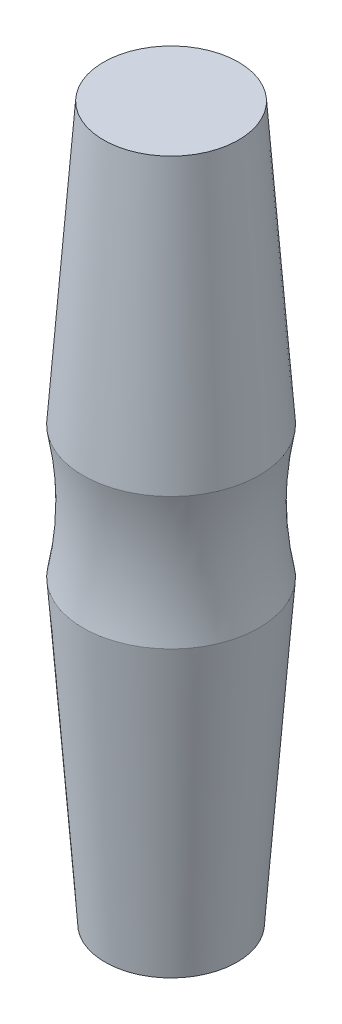
ISO-10303-21;
HEADER;
FILE_DESCRIPTION(('STEP AP214'),'2;1');
FILE_NAME('part.step','',(''),(''),'','','');
FILE_SCHEMA(('AUTOMOTIVE_DESIGN { 1 0 10303 214 1 1 1 1 }'));
ENDSEC;
DATA;
#1=APPLICATION_CONTEXT('core data for automotive mechanical design processes');
#2=APPLICATION_PROTOCOL_DEFINITION('international standard','automotive_design',2000,#1);
#3=PRODUCT_CONTEXT('',#1,'mechanical');
#4=PRODUCT('Part','Part','',(#3));
#5=PRODUCT_RELATED_PRODUCT_CATEGORY('part','',(#4));
#6=PRODUCT_DEFINITION_FORMATION('','',#4);
#7=PRODUCT_DEFINITION_CONTEXT('part definition',#1,'design');
#8=PRODUCT_DEFINITION('design','',#6,#7);
#9=PRODUCT_DEFINITION_SHAPE('','',#8);
#10=(LENGTH_UNIT() NAMED_UNIT(*) SI_UNIT(.MILLI.,.METRE.));
#11=(NAMED_UNIT(*) PLANE_ANGLE_UNIT() SI_UNIT($,.RADIAN.));
#12=(NAMED_UNIT(*) SI_UNIT($,.STERADIAN.) SOLID_ANGLE_UNIT());
#13=UNCERTAINTY_MEASURE_WITH_UNIT(LENGTH_MEASURE(1.E-05),#10,'distance_accuracy_value','');
#14=(GEOMETRIC_REPRESENTATION_CONTEXT(3) GLOBAL_UNCERTAINTY_ASSIGNED_CONTEXT((#13)) GLOBAL_UNIT_ASSIGNED_CONTEXT((#10,
#11,#12)) REPRESENTATION_CONTEXT('',''));
#15=CARTESIAN_POINT('',(0.,0.,0.));
#16=DIRECTION('',(0.,0.,1.));
#17=DIRECTION('',(1.,0.,0.));
#18=AXIS2_PLACEMENT_3D('',#15,#16,#17);
#19=CARTESIAN_POINT('',(6.,-33.31,0.));
#20=DIRECTION('',(0.,-1.,0.));
#21=DIRECTION('',(0.,0.,-1.));
#22=AXIS2_PLACEMENT_3D('',#19,#20,#21);
#23=PLANE('',#22);
#24=CARTESIAN_POINT('',(0.,-33.31,0.));
#25=DIRECTION('',(0.,-1.,0.));
#26=DIRECTION('',(0.,0.,-1.));
#27=AXIS2_PLACEMENT_3D('',#24,#25,#26);
#28=CIRCLE('',#27,6.);
#29=CARTESIAN_POINT('',(0.,-33.31,-6.));
#30=VERTEX_POINT('',#29);
#31=EDGE_CURVE('E10',#30,#30,#28,.T.);
#32=ORIENTED_EDGE('',*,*,#31,.T.);
#33=EDGE_LOOP('',(#32));
#34=FACE_BOUND('',#33,.T.);
#35=ADVANCED_FACE('F35',(#34),#23,.T.);
#36=CARTESIAN_POINT('',(0.,-33.31,0.));
#37=DIRECTION('',(0.,1.,0.));
#38=DIRECTION('',(0.,0.,1.));
#39=AXIS2_PLACEMENT_3D('',#36,#37,#38);
#40=CONICAL_SURFACE('',#39,6.,0.073102748280893);
#41=CARTESIAN_POINT('',(0.,-5.99999999999998,0.));
#42=DIRECTION('',(0.,-1.,0.));
#43=DIRECTION('',(0.,0.,-1.));
#44=AXIS2_PLACEMENT_3D('',#41,#42,#43);
#45=CIRCLE('',#44,8.);
#46=CARTESIAN_POINT('',(0.,-5.99999999999998,-8.));
#47=VERTEX_POINT('',#46);
#48=EDGE_CURVE('E41',#47,#47,#45,.T.);
#49=ORIENTED_EDGE('',*,*,#48,.T.);
#50=EDGE_LOOP('',(#49));
#51=FACE_BOUND('',#50,.T.);
#52=ORIENTED_EDGE('',*,*,#31,.F.);
#53=EDGE_LOOP('',(#52));
#54=FACE_BOUND('',#53,.T.);
#55=ADVANCED_FACE('F67',(#51,#54),#40,.T.);
#56=CARTESIAN_POINT('',(0.,0.,0.));
#57=DIRECTION('',(0.,-1.,0.));
#58=DIRECTION('',(0.,0.,-1.));
#59=AXIS2_PLACEMENT_3D('',#56,#57,#58);
#60=TOROIDAL_SURFACE('',#59,38.,30.5941170815567);
#61=CARTESIAN_POINT('',(0.,6.,0.));
#62=DIRECTION('',(0.,-1.,0.));
#63=DIRECTION('',(0.,0.,-1.));
#64=AXIS2_PLACEMENT_3D('',#61,#62,#63);
#65=CIRCLE('',#64,8.);
#66=CARTESIAN_POINT('',(0.,6.,-8.));
#67=VERTEX_POINT('',#66);
#68=EDGE_CURVE('E45',#67,#67,#65,.T.);
#69=ORIENTED_EDGE('',*,*,#68,.T.);
#70=EDGE_LOOP('',(#69));
#71=FACE_BOUND('',#70,.T.);
#72=ORIENTED_EDGE('',*,*,#48,.F.);
#73=EDGE_LOOP('',(#72));
#74=FACE_BOUND('',#73,.T.);
#75=ADVANCED_FACE('F64',(#71,#74),#60,.F.);
#76=CARTESIAN_POINT('',(0.,6.,0.));
#77=DIRECTION('',(0.,-1.,0.));
#78=DIRECTION('',(0.,0.,-1.));
#79=AXIS2_PLACEMENT_3D('',#76,#77,#78);
#80=CONICAL_SURFACE('',#79,8.,0.073102748280887);
#81=CARTESIAN_POINT('',(0.,31.47,0.));
#82=DIRECTION('',(0.,-1.,0.));
#83=DIRECTION('',(0.,0.,-1.));
#84=AXIS2_PLACEMENT_3D('',#81,#82,#83);
#85=CIRCLE('',#84,6.13474917612612);
#86=CARTESIAN_POINT('',(0.,31.47,-6.13474917612612));
#87=VERTEX_POINT('',#86);
#88=EDGE_CURVE('E49',#87,#87,#85,.T.);
#89=ORIENTED_EDGE('',*,*,#88,.T.);
#90=EDGE_LOOP('',(#89));
#91=FACE_BOUND('',#90,.T.);
#92=ORIENTED_EDGE('',*,*,#68,.F.);
#93=EDGE_LOOP('',(#92));
#94=FACE_BOUND('',#93,.T.);
#95=ADVANCED_FACE('F55',(#91,#94),#80,.T.);
#96=CARTESIAN_POINT('',(0.,31.47,0.));
#97=DIRECTION('',(0.,1.,0.));
#98=DIRECTION('',(0.,0.,1.));
#99=AXIS2_PLACEMENT_3D('',#96,#97,#98);
#100=PLANE('',#99);
#101=ORIENTED_EDGE('',*,*,#88,.F.);
#102=EDGE_LOOP('',(#101));
#103=FACE_BOUND('',#102,.T.);
#104=ADVANCED_FACE('F58',(#103),#100,.T.);
#105=CLOSED_SHELL('',(#35,#55,#75,#95,#104));
#106=MANIFOLD_SOLID_BREP('B2',#105);
#107=ADVANCED_BREP_SHAPE_REPRESENTATION('',(#18,#106),#14);
#108=SHAPE_DEFINITION_REPRESENTATION(#9,#107);
ENDSEC;
END-ISO-10303-21;
